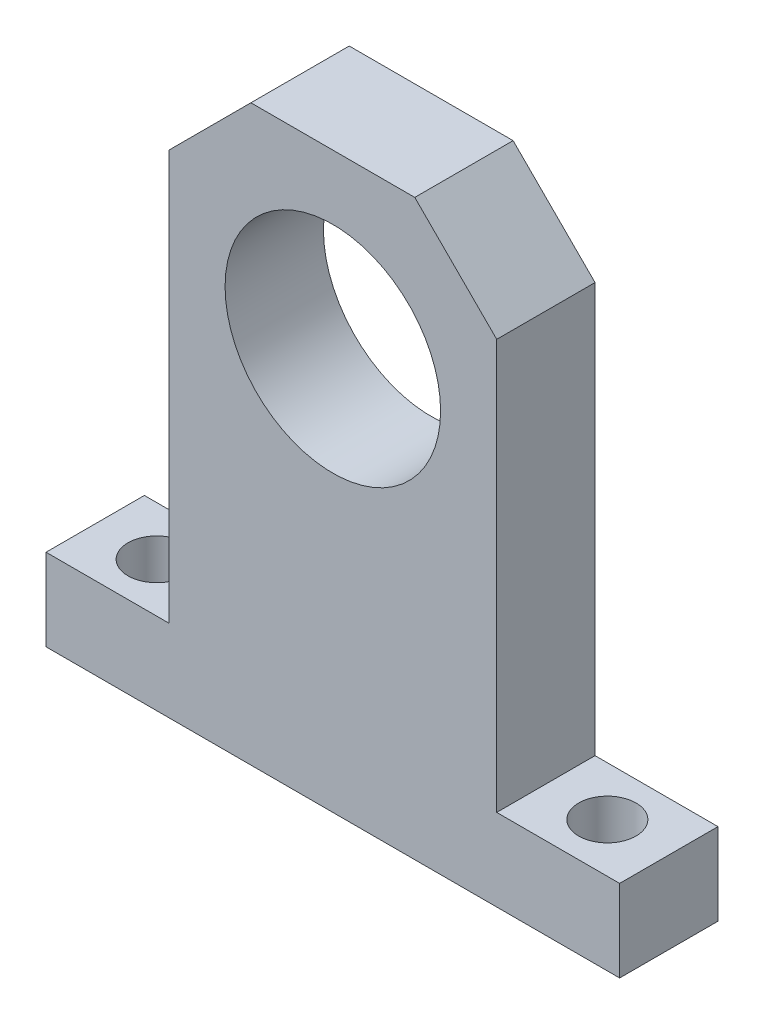
ISO-10303-21;
HEADER;
FILE_DESCRIPTION(('STEP AP214'),'2;1');
FILE_NAME('part.step','',(''),(''),'','','');
FILE_SCHEMA(('AUTOMOTIVE_DESIGN { 1 0 10303 214 1 1 1 1 }'));
ENDSEC;
DATA;
#1=APPLICATION_CONTEXT('core data for automotive mechanical design processes');
#2=APPLICATION_PROTOCOL_DEFINITION('international standard','automotive_design',2000,#1);
#3=PRODUCT_CONTEXT('',#1,'mechanical');
#4=PRODUCT('Part','Part','',(#3));
#5=PRODUCT_RELATED_PRODUCT_CATEGORY('part','',(#4));
#6=PRODUCT_DEFINITION_FORMATION('','',#4);
#7=PRODUCT_DEFINITION_CONTEXT('part definition',#1,'design');
#8=PRODUCT_DEFINITION('design','',#6,#7);
#9=PRODUCT_DEFINITION_SHAPE('','',#8);
#10=(LENGTH_UNIT() NAMED_UNIT(*) SI_UNIT(.MILLI.,.METRE.));
#11=(NAMED_UNIT(*) PLANE_ANGLE_UNIT() SI_UNIT($,.RADIAN.));
#12=(NAMED_UNIT(*) SI_UNIT($,.STERADIAN.) SOLID_ANGLE_UNIT());
#13=UNCERTAINTY_MEASURE_WITH_UNIT(LENGTH_MEASURE(1.E-05),#10,'distance_accuracy_value','');
#14=(GEOMETRIC_REPRESENTATION_CONTEXT(3) GLOBAL_UNCERTAINTY_ASSIGNED_CONTEXT((#13)) GLOBAL_UNIT_ASSIGNED_CONTEXT((#10,
#11,#12)) REPRESENTATION_CONTEXT('',''));
#15=CARTESIAN_POINT('',(0.,0.,0.));
#16=DIRECTION('',(0.,0.,1.));
#17=DIRECTION('',(1.,0.,0.));
#18=AXIS2_PLACEMENT_3D('',#15,#16,#17);
#19=CARTESIAN_POINT('',(0.,0.,12.));
#20=DIRECTION('',(0.,0.,1.));
#21=DIRECTION('',(1.,0.,0.));
#22=AXIS2_PLACEMENT_3D('',#19,#20,#21);
#23=PLANE('',#22);
#24=DIRECTION('',(0.,1.,0.));
#25=VECTOR('',#24,1.);
#26=CARTESIAN_POINT('',(40.,0.,12.));
#27=LINE('',#26,#25);
#28=CARTESIAN_POINT('',(40.,0.,12.));
#29=VERTEX_POINT('',#28);
#30=CARTESIAN_POINT('',(40.,50.,12.));
#31=VERTEX_POINT('',#30);
#32=EDGE_CURVE('E174',#29,#31,#27,.T.);
#33=ORIENTED_EDGE('',*,*,#32,.T.);
#34=DIRECTION('',(-0.707106781186547,0.707106781186549,0.));
#35=VECTOR('',#34,1.);
#36=CARTESIAN_POINT('',(45.,44.9999999999999,12.));
#37=LINE('',#36,#35);
#38=CARTESIAN_POINT('',(30.,60.,12.));
#39=VERTEX_POINT('',#38);
#40=EDGE_CURVE('E12',#31,#39,#37,.T.);
#41=ORIENTED_EDGE('',*,*,#40,.T.);
#42=DIRECTION('',(1.,0.,0.));
#43=VECTOR('',#42,1.);
#44=CARTESIAN_POINT('',(0.,60.,12.));
#45=LINE('',#44,#43);
#46=CARTESIAN_POINT('',(10.,60.,12.));
#47=VERTEX_POINT('',#46);
#48=EDGE_CURVE('E159',#47,#39,#45,.T.);
#49=ORIENTED_EDGE('',*,*,#48,.F.);
#50=DIRECTION('',(0.707106781186549,0.707106781186547,0.));
#51=VECTOR('',#50,1.);
#52=CARTESIAN_POINT('',(-25.,25.0000000000001,12.));
#53=LINE('',#52,#51);
#54=CARTESIAN_POINT('',(0.,50.,12.));
#55=VERTEX_POINT('',#54);
#56=EDGE_CURVE('E158',#47,#55,#53,.F.);
#57=ORIENTED_EDGE('',*,*,#56,.T.);
#58=DIRECTION('',(0.,1.,0.));
#59=VECTOR('',#58,1.);
#60=CARTESIAN_POINT('',(0.,0.,12.));
#61=LINE('',#60,#59);
#62=CARTESIAN_POINT('',(0.,0.,12.));
#63=VERTEX_POINT('',#62);
#64=EDGE_CURVE('E141',#63,#55,#61,.T.);
#65=ORIENTED_EDGE('',*,*,#64,.F.);
#66=DIRECTION('',(1.,0.,0.));
#67=VECTOR('',#66,1.);
#68=CARTESIAN_POINT('',(-15.,0.,12.));
#69=LINE('',#68,#67);
#70=CARTESIAN_POINT('',(-15.,0.,12.));
#71=VERTEX_POINT('',#70);
#72=EDGE_CURVE('E155',#71,#63,#69,.T.);
#73=ORIENTED_EDGE('',*,*,#72,.F.);
#74=DIRECTION('',(0.,-1.,0.));
#75=VECTOR('',#74,1.);
#76=CARTESIAN_POINT('',(-15.,0.,12.));
#77=LINE('',#76,#75);
#78=CARTESIAN_POINT('',(-15.,-10.,12.));
#79=VERTEX_POINT('',#78);
#80=EDGE_CURVE('E150',#71,#79,#77,.T.);
#81=ORIENTED_EDGE('',*,*,#80,.T.);
#82=DIRECTION('',(1.,0.,0.));
#83=VECTOR('',#82,1.);
#84=CARTESIAN_POINT('',(-15.,-10.,12.));
#85=LINE('',#84,#83);
#86=CARTESIAN_POINT('',(55.,-10.,12.));
#87=VERTEX_POINT('',#86);
#88=EDGE_CURVE('E182',#79,#87,#85,.T.);
#89=ORIENTED_EDGE('',*,*,#88,.T.);
#90=DIRECTION('',(0.,-1.,0.));
#91=VECTOR('',#90,1.);
#92=CARTESIAN_POINT('',(55.,0.,12.));
#93=LINE('',#92,#91);
#94=CARTESIAN_POINT('',(55.,0.,12.));
#95=VERTEX_POINT('',#94);
#96=EDGE_CURVE('E179',#95,#87,#93,.T.);
#97=ORIENTED_EDGE('',*,*,#96,.F.);
#98=DIRECTION('',(1.,0.,0.));
#99=VECTOR('',#98,1.);
#100=CARTESIAN_POINT('',(40.,0.,12.));
#101=LINE('',#100,#99);
#102=EDGE_CURVE('E176',#29,#95,#101,.T.);
#103=ORIENTED_EDGE('',*,*,#102,.F.);
#104=EDGE_LOOP('',(#33,#41,#49,#57,#65,#73,#81,#89,#97,#103));
#105=FACE_BOUND('',#104,.T.);
#106=CARTESIAN_POINT('',(20.,39.,12.));
#107=DIRECTION('',(0.,0.,1.));
#108=DIRECTION('',(1.,0.,0.));
#109=AXIS2_PLACEMENT_3D('',#106,#107,#108);
#110=CIRCLE('',#109,13.15);
#111=CARTESIAN_POINT('',(33.15,39.,12.));
#112=VERTEX_POINT('',#111);
#113=EDGE_CURVE('E187',#112,#112,#110,.T.);
#114=ORIENTED_EDGE('',*,*,#113,.F.);
#115=EDGE_LOOP('',(#114));
#116=FACE_BOUND('',#115,.T.);
#117=ADVANCED_FACE('F60',(#105,#116),#23,.T.);
#118=CARTESIAN_POINT('',(0.,0.,0.));
#119=DIRECTION('',(0.,0.,1.));
#120=DIRECTION('',(1.,0.,0.));
#121=AXIS2_PLACEMENT_3D('',#118,#119,#120);
#122=PLANE('',#121);
#123=DIRECTION('',(1.,0.,0.));
#124=VECTOR('',#123,1.);
#125=CARTESIAN_POINT('',(0.,60.,0.));
#126=LINE('',#125,#124);
#127=CARTESIAN_POINT('',(10.,60.,0.));
#128=VERTEX_POINT('',#127);
#129=CARTESIAN_POINT('',(30.,60.,0.));
#130=VERTEX_POINT('',#129);
#131=EDGE_CURVE('E189',#128,#130,#126,.T.);
#132=ORIENTED_EDGE('',*,*,#131,.T.);
#133=DIRECTION('',(0.707106781186547,-0.707106781186549,0.));
#134=VECTOR('',#133,1.);
#135=CARTESIAN_POINT('',(30.,60.,0.));
#136=LINE('',#135,#134);
#137=CARTESIAN_POINT('',(40.,50.,0.));
#138=VERTEX_POINT('',#137);
#139=EDGE_CURVE('E82',#130,#138,#136,.T.);
#140=ORIENTED_EDGE('',*,*,#139,.T.);
#141=DIRECTION('',(0.,1.,0.));
#142=VECTOR('',#141,1.);
#143=CARTESIAN_POINT('',(40.,0.,0.));
#144=LINE('',#143,#142);
#145=CARTESIAN_POINT('',(40.,0.,0.));
#146=VERTEX_POINT('',#145);
#147=EDGE_CURVE('E191',#146,#138,#144,.T.);
#148=ORIENTED_EDGE('',*,*,#147,.F.);
#149=DIRECTION('',(1.,0.,0.));
#150=VECTOR('',#149,1.);
#151=CARTESIAN_POINT('',(40.,0.,0.));
#152=LINE('',#151,#150);
#153=CARTESIAN_POINT('',(55.,0.,0.));
#154=VERTEX_POINT('',#153);
#155=EDGE_CURVE('E193',#146,#154,#152,.T.);
#156=ORIENTED_EDGE('',*,*,#155,.T.);
#157=DIRECTION('',(0.,-1.,0.));
#158=VECTOR('',#157,1.);
#159=CARTESIAN_POINT('',(55.,0.,0.));
#160=LINE('',#159,#158);
#161=CARTESIAN_POINT('',(55.,-10.,0.));
#162=VERTEX_POINT('',#161);
#163=EDGE_CURVE('E196',#154,#162,#160,.T.);
#164=ORIENTED_EDGE('',*,*,#163,.T.);
#165=DIRECTION('',(1.,0.,0.));
#166=VECTOR('',#165,1.);
#167=CARTESIAN_POINT('',(-15.,-10.,0.));
#168=LINE('',#167,#166);
#169=CARTESIAN_POINT('',(-15.,-10.,0.));
#170=VERTEX_POINT('',#169);
#171=EDGE_CURVE('E166',#170,#162,#168,.T.);
#172=ORIENTED_EDGE('',*,*,#171,.F.);
#173=DIRECTION('',(0.,-1.,0.));
#174=VECTOR('',#173,1.);
#175=CARTESIAN_POINT('',(-15.,0.,0.));
#176=LINE('',#175,#174);
#177=CARTESIAN_POINT('',(-15.,0.,0.));
#178=VERTEX_POINT('',#177);
#179=EDGE_CURVE('E164',#178,#170,#176,.T.);
#180=ORIENTED_EDGE('',*,*,#179,.F.);
#181=DIRECTION('',(1.,0.,0.));
#182=VECTOR('',#181,1.);
#183=CARTESIAN_POINT('',(-15.,0.,0.));
#184=LINE('',#183,#182);
#185=CARTESIAN_POINT('',(0.,0.,0.));
#186=VERTEX_POINT('',#185);
#187=EDGE_CURVE('E185',#178,#186,#184,.T.);
#188=ORIENTED_EDGE('',*,*,#187,.T.);
#189=DIRECTION('',(0.,1.,0.));
#190=VECTOR('',#189,1.);
#191=CARTESIAN_POINT('',(0.,0.,0.));
#192=LINE('',#191,#190);
#193=CARTESIAN_POINT('',(0.,50.,0.));
#194=VERTEX_POINT('',#193);
#195=EDGE_CURVE('E144',#186,#194,#192,.T.);
#196=ORIENTED_EDGE('',*,*,#195,.T.);
#197=DIRECTION('',(-0.707106781186549,-0.707106781186547,0.));
#198=VECTOR('',#197,1.);
#199=CARTESIAN_POINT('',(0.,50.,0.));
#200=LINE('',#199,#198);
#201=EDGE_CURVE('E212',#194,#128,#200,.F.);
#202=ORIENTED_EDGE('',*,*,#201,.T.);
#203=EDGE_LOOP('',(#132,#140,#148,#156,#164,#172,#180,#188,#196,#202));
#204=FACE_BOUND('',#203,.T.);
#205=CARTESIAN_POINT('',(20.,39.,0.));
#206=DIRECTION('',(0.,0.,1.));
#207=DIRECTION('',(1.,0.,0.));
#208=AXIS2_PLACEMENT_3D('',#205,#206,#207);
#209=CIRCLE('',#208,13.15);
#210=CARTESIAN_POINT('',(33.15,39.,0.));
#211=VERTEX_POINT('',#210);
#212=EDGE_CURVE('E169',#211,#211,#209,.T.);
#213=ORIENTED_EDGE('',*,*,#212,.T.);
#214=EDGE_LOOP('',(#213));
#215=FACE_BOUND('',#214,.T.);
#216=ADVANCED_FACE('F227',(#204,#215),#122,.F.);
#217=CARTESIAN_POINT('',(-15.,0.,12.));
#218=DIRECTION('',(0.,1.,0.));
#219=DIRECTION('',(0.,0.,1.));
#220=AXIS2_PLACEMENT_3D('',#217,#218,#219);
#221=PLANE('',#220);
#222=CARTESIAN_POINT('',(-7.5,0.,6.));
#223=DIRECTION('',(0.,1.,0.));
#224=DIRECTION('',(0.,0.,1.));
#225=AXIS2_PLACEMENT_3D('',#222,#223,#224);
#226=CIRCLE('',#225,3.5);
#227=CARTESIAN_POINT('',(-7.5,0.,9.5));
#228=VERTEX_POINT('',#227);
#229=EDGE_CURVE('E276',#228,#228,#226,.T.);
#230=ORIENTED_EDGE('',*,*,#229,.F.);
#231=EDGE_LOOP('',(#230));
#232=FACE_BOUND('',#231,.T.);
#233=ORIENTED_EDGE('',*,*,#187,.F.);
#234=DIRECTION('',(0.,0.,-1.));
#235=VECTOR('',#234,1.);
#236=CARTESIAN_POINT('',(-15.,0.,12.));
#237=LINE('',#236,#235);
#238=EDGE_CURVE('E162',#71,#178,#237,.T.);
#239=ORIENTED_EDGE('',*,*,#238,.F.);
#240=ORIENTED_EDGE('',*,*,#72,.T.);
#241=DIRECTION('',(0.,0.,-1.));
#242=VECTOR('',#241,1.);
#243=CARTESIAN_POINT('',(0.,0.,12.));
#244=LINE('',#243,#242);
#245=EDGE_CURVE('E137',#63,#186,#244,.T.);
#246=ORIENTED_EDGE('',*,*,#245,.T.);
#247=EDGE_LOOP('',(#233,#239,#240,#246));
#248=FACE_BOUND('',#247,.T.);
#249=ADVANCED_FACE('F161',(#232,#248),#221,.T.);
#250=CARTESIAN_POINT('',(-15.,0.,12.));
#251=DIRECTION('',(1.,0.,0.));
#252=DIRECTION('',(0.,1.,0.));
#253=AXIS2_PLACEMENT_3D('',#250,#251,#252);
#254=PLANE('',#253);
#255=ORIENTED_EDGE('',*,*,#179,.T.);
#256=DIRECTION('',(0.,0.,-1.));
#257=VECTOR('',#256,1.);
#258=CARTESIAN_POINT('',(-15.,-10.,12.));
#259=LINE('',#258,#257);
#260=EDGE_CURVE('E203',#79,#170,#259,.T.);
#261=ORIENTED_EDGE('',*,*,#260,.F.);
#262=ORIENTED_EDGE('',*,*,#80,.F.);
#263=ORIENTED_EDGE('',*,*,#238,.T.);
#264=EDGE_LOOP('',(#255,#261,#262,#263));
#265=FACE_BOUND('',#264,.T.);
#266=ADVANCED_FACE('F247',(#265),#254,.F.);
#267=CARTESIAN_POINT('',(-15.,-10.,12.));
#268=DIRECTION('',(0.,1.,0.));
#269=DIRECTION('',(0.,0.,1.));
#270=AXIS2_PLACEMENT_3D('',#267,#268,#269);
#271=PLANE('',#270);
#272=CARTESIAN_POINT('',(-7.5,-10.,6.));
#273=DIRECTION('',(0.,1.,0.));
#274=DIRECTION('',(0.,0.,1.));
#275=AXIS2_PLACEMENT_3D('',#272,#273,#274);
#276=CIRCLE('',#275,3.5);
#277=CARTESIAN_POINT('',(-7.5,-10.,9.5));
#278=VERTEX_POINT('',#277);
#279=EDGE_CURVE('E278',#278,#278,#276,.T.);
#280=ORIENTED_EDGE('',*,*,#279,.T.);
#281=EDGE_LOOP('',(#280));
#282=FACE_BOUND('',#281,.T.);
#283=CARTESIAN_POINT('',(47.5,-10.,6.));
#284=DIRECTION('',(0.,1.,0.));
#285=DIRECTION('',(0.,0.,1.));
#286=AXIS2_PLACEMENT_3D('',#283,#284,#285);
#287=CIRCLE('',#286,3.5);
#288=CARTESIAN_POINT('',(47.5,-10.,9.5));
#289=VERTEX_POINT('',#288);
#290=EDGE_CURVE('E284',#289,#289,#287,.T.);
#291=ORIENTED_EDGE('',*,*,#290,.T.);
#292=EDGE_LOOP('',(#291));
#293=FACE_BOUND('',#292,.T.);
#294=ORIENTED_EDGE('',*,*,#171,.T.);
#295=DIRECTION('',(0.,0.,-1.));
#296=VECTOR('',#295,1.);
#297=CARTESIAN_POINT('',(55.,-10.,12.));
#298=LINE('',#297,#296);
#299=EDGE_CURVE('E206',#87,#162,#298,.T.);
#300=ORIENTED_EDGE('',*,*,#299,.F.);
#301=ORIENTED_EDGE('',*,*,#88,.F.);
#302=ORIENTED_EDGE('',*,*,#260,.T.);
#303=EDGE_LOOP('',(#294,#300,#301,#302));
#304=FACE_BOUND('',#303,.T.);
#305=ADVANCED_FACE('F250',(#282,#293,#304),#271,.F.);
#306=CARTESIAN_POINT('',(55.,0.,12.));
#307=DIRECTION('',(1.,0.,0.));
#308=DIRECTION('',(0.,1.,0.));
#309=AXIS2_PLACEMENT_3D('',#306,#307,#308);
#310=PLANE('',#309);
#311=ORIENTED_EDGE('',*,*,#163,.F.);
#312=DIRECTION('',(0.,0.,-1.));
#313=VECTOR('',#312,1.);
#314=CARTESIAN_POINT('',(55.,0.,12.));
#315=LINE('',#314,#313);
#316=EDGE_CURVE('E208',#95,#154,#315,.T.);
#317=ORIENTED_EDGE('',*,*,#316,.F.);
#318=ORIENTED_EDGE('',*,*,#96,.T.);
#319=ORIENTED_EDGE('',*,*,#299,.T.);
#320=EDGE_LOOP('',(#311,#317,#318,#319));
#321=FACE_BOUND('',#320,.T.);
#322=ADVANCED_FACE('F254',(#321),#310,.T.);
#323=CARTESIAN_POINT('',(40.,0.,12.));
#324=DIRECTION('',(0.,1.,0.));
#325=DIRECTION('',(0.,0.,1.));
#326=AXIS2_PLACEMENT_3D('',#323,#324,#325);
#327=PLANE('',#326);
#328=CARTESIAN_POINT('',(47.5,0.,6.));
#329=DIRECTION('',(0.,1.,0.));
#330=DIRECTION('',(0.,0.,1.));
#331=AXIS2_PLACEMENT_3D('',#328,#329,#330);
#332=CIRCLE('',#331,3.5);
#333=CARTESIAN_POINT('',(47.5,0.,9.5));
#334=VERTEX_POINT('',#333);
#335=EDGE_CURVE('E281',#334,#334,#332,.T.);
#336=ORIENTED_EDGE('',*,*,#335,.F.);
#337=EDGE_LOOP('',(#336));
#338=FACE_BOUND('',#337,.T.);
#339=ORIENTED_EDGE('',*,*,#155,.F.);
#340=DIRECTION('',(0.,0.,-1.));
#341=VECTOR('',#340,1.);
#342=CARTESIAN_POINT('',(40.,0.,12.));
#343=LINE('',#342,#341);
#344=EDGE_CURVE('E149',#29,#146,#343,.T.);
#345=ORIENTED_EDGE('',*,*,#344,.F.);
#346=ORIENTED_EDGE('',*,*,#102,.T.);
#347=ORIENTED_EDGE('',*,*,#316,.T.);
#348=EDGE_LOOP('',(#339,#345,#346,#347));
#349=FACE_BOUND('',#348,.T.);
#350=ADVANCED_FACE('F258',(#338,#349),#327,.T.);
#351=CARTESIAN_POINT('',(40.,0.,12.));
#352=DIRECTION('',(-1.,0.,0.));
#353=DIRECTION('',(0.,-1.,0.));
#354=AXIS2_PLACEMENT_3D('',#351,#352,#353);
#355=PLANE('',#354);
#356=ORIENTED_EDGE('',*,*,#147,.T.);
#357=DIRECTION('',(0.,0.,1.));
#358=VECTOR('',#357,1.);
#359=CARTESIAN_POINT('',(40.,50.,12.));
#360=LINE('',#359,#358);
#361=EDGE_CURVE('E68',#138,#31,#360,.T.);
#362=ORIENTED_EDGE('',*,*,#361,.T.);
#363=ORIENTED_EDGE('',*,*,#32,.F.);
#364=ORIENTED_EDGE('',*,*,#344,.T.);
#365=EDGE_LOOP('',(#356,#362,#363,#364));
#366=FACE_BOUND('',#365,.T.);
#367=ADVANCED_FACE('F262',(#366),#355,.F.);
#368=CARTESIAN_POINT('',(0.,60.,12.));
#369=DIRECTION('',(0.,1.,0.));
#370=DIRECTION('',(0.,0.,1.));
#371=AXIS2_PLACEMENT_3D('',#368,#369,#370);
#372=PLANE('',#371);
#373=ORIENTED_EDGE('',*,*,#48,.T.);
#374=DIRECTION('',(0.,0.,-1.));
#375=VECTOR('',#374,1.);
#376=CARTESIAN_POINT('',(30.,60.,0.));
#377=LINE('',#376,#375);
#378=EDGE_CURVE('E217',#39,#130,#377,.T.);
#379=ORIENTED_EDGE('',*,*,#378,.T.);
#380=ORIENTED_EDGE('',*,*,#131,.F.);
#381=DIRECTION('',(0.,0.,1.));
#382=VECTOR('',#381,1.);
#383=CARTESIAN_POINT('',(10.,60.,12.));
#384=LINE('',#383,#382);
#385=EDGE_CURVE('E214',#128,#47,#384,.T.);
#386=ORIENTED_EDGE('',*,*,#385,.T.);
#387=EDGE_LOOP('',(#373,#379,#380,#386));
#388=FACE_BOUND('',#387,.T.);
#389=ADVANCED_FACE('F223',(#388),#372,.T.);
#390=CARTESIAN_POINT('',(0.,0.,12.));
#391=DIRECTION('',(-1.,0.,0.));
#392=DIRECTION('',(0.,-1.,0.));
#393=AXIS2_PLACEMENT_3D('',#390,#391,#392);
#394=PLANE('',#393);
#395=ORIENTED_EDGE('',*,*,#64,.T.);
#396=DIRECTION('',(0.,0.,-1.));
#397=VECTOR('',#396,1.);
#398=CARTESIAN_POINT('',(0.,50.,12.));
#399=LINE('',#398,#397);
#400=EDGE_CURVE('E202',#55,#194,#399,.T.);
#401=ORIENTED_EDGE('',*,*,#400,.T.);
#402=ORIENTED_EDGE('',*,*,#195,.F.);
#403=ORIENTED_EDGE('',*,*,#245,.F.);
#404=EDGE_LOOP('',(#395,#401,#402,#403));
#405=FACE_BOUND('',#404,.T.);
#406=ADVANCED_FACE('F139',(#405),#394,.T.);
#407=CARTESIAN_POINT('',(20.,39.,12.));
#408=DIRECTION('',(0.,0.,-1.));
#409=DIRECTION('',(-1.,0.,0.));
#410=AXIS2_PLACEMENT_3D('',#407,#408,#409);
#411=CYLINDRICAL_SURFACE('',#410,13.15);
#412=ORIENTED_EDGE('',*,*,#113,.T.);
#413=EDGE_LOOP('',(#412));
#414=FACE_BOUND('',#413,.T.);
#415=ORIENTED_EDGE('',*,*,#212,.F.);
#416=EDGE_LOOP('',(#415));
#417=FACE_BOUND('',#416,.T.);
#418=ADVANCED_FACE('F244',(#414,#417),#411,.F.);
#419=CARTESIAN_POINT('',(47.5,-10.,6.));
#420=DIRECTION('',(0.,1.,0.));
#421=DIRECTION('',(0.,0.,1.));
#422=AXIS2_PLACEMENT_3D('',#419,#420,#421);
#423=CYLINDRICAL_SURFACE('',#422,3.5);
#424=ORIENTED_EDGE('',*,*,#290,.F.);
#425=EDGE_LOOP('',(#424));
#426=FACE_BOUND('',#425,.T.);
#427=ORIENTED_EDGE('',*,*,#335,.T.);
#428=EDGE_LOOP('',(#427));
#429=FACE_BOUND('',#428,.T.);
#430=ADVANCED_FACE('F295',(#426,#429),#423,.F.);
#431=CARTESIAN_POINT('',(-7.5,-10.,6.));
#432=DIRECTION('',(0.,1.,0.));
#433=DIRECTION('',(0.,0.,1.));
#434=AXIS2_PLACEMENT_3D('',#431,#432,#433);
#435=CYLINDRICAL_SURFACE('',#434,3.5);
#436=ORIENTED_EDGE('',*,*,#279,.F.);
#437=EDGE_LOOP('',(#436));
#438=FACE_BOUND('',#437,.T.);
#439=ORIENTED_EDGE('',*,*,#229,.T.);
#440=EDGE_LOOP('',(#439));
#441=FACE_BOUND('',#440,.T.);
#442=ADVANCED_FACE('F236',(#438,#441),#435,.F.);
#443=CARTESIAN_POINT('',(0.,50.,12.));
#444=DIRECTION('',(0.707106781186547,-0.707106781186549,0.));
#445=DIRECTION('',(0.,0.,-1.));
#446=AXIS2_PLACEMENT_3D('',#443,#444,#445);
#447=PLANE('',#446);
#448=ORIENTED_EDGE('',*,*,#56,.F.);
#449=ORIENTED_EDGE('',*,*,#385,.F.);
#450=ORIENTED_EDGE('',*,*,#201,.F.);
#451=ORIENTED_EDGE('',*,*,#400,.F.);
#452=EDGE_LOOP('',(#448,#449,#450,#451));
#453=FACE_BOUND('',#452,.T.);
#454=ADVANCED_FACE('F230',(#453),#447,.F.);
#455=CARTESIAN_POINT('',(30.,60.,12.));
#456=DIRECTION('',(0.707106781186549,0.707106781186547,0.));
#457=DIRECTION('',(0.,0.,1.));
#458=AXIS2_PLACEMENT_3D('',#455,#456,#457);
#459=PLANE('',#458);
#460=ORIENTED_EDGE('',*,*,#40,.F.);
#461=ORIENTED_EDGE('',*,*,#361,.F.);
#462=ORIENTED_EDGE('',*,*,#139,.F.);
#463=ORIENTED_EDGE('',*,*,#378,.F.);
#464=EDGE_LOOP('',(#460,#461,#462,#463));
#465=FACE_BOUND('',#464,.T.);
#466=ADVANCED_FACE('F62',(#465),#459,.T.);
#467=CLOSED_SHELL('',(#117,#216,#249,#266,#305,#322,#350,#367,#389,#406,#418,#430,#442,#454,#466));
#468=MANIFOLD_SOLID_BREP('B2',#467);
#469=ADVANCED_BREP_SHAPE_REPRESENTATION('',(#18,#468),#14);
#470=SHAPE_DEFINITION_REPRESENTATION(#9,#469);
ENDSEC;
END-ISO-10303-21;
